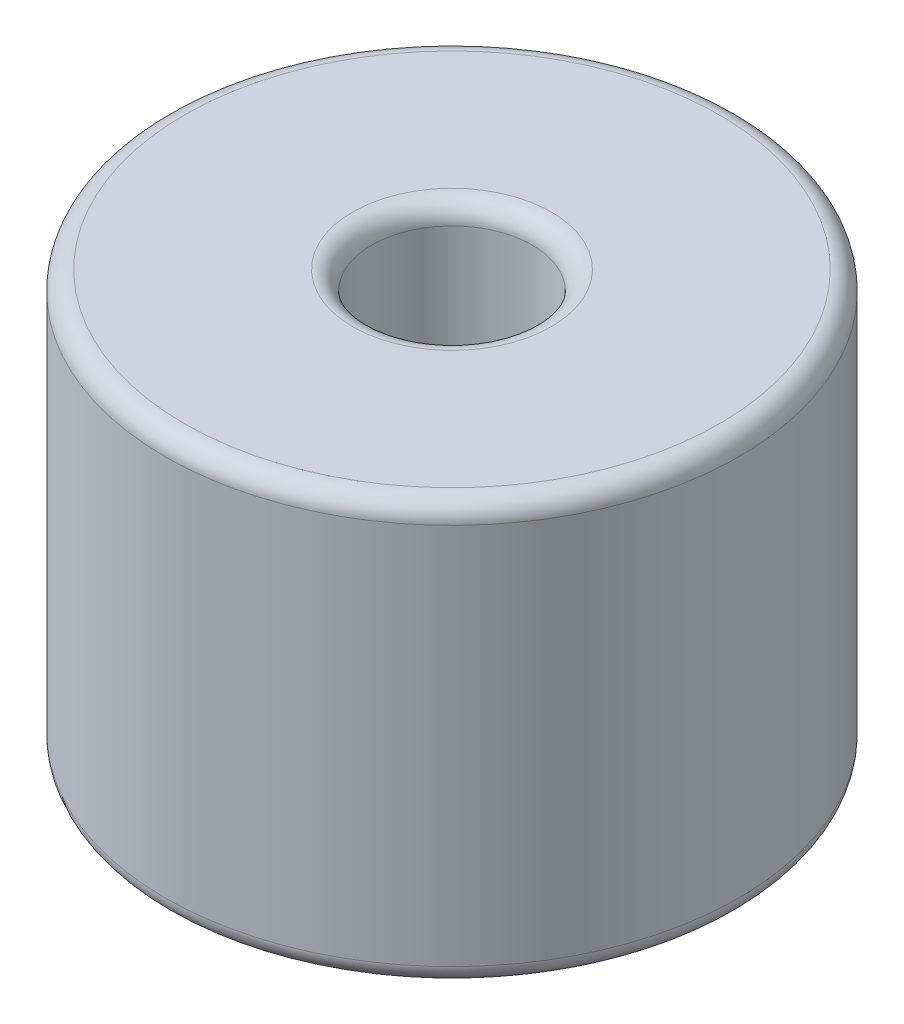
ISO-10303-21;
HEADER;
FILE_DESCRIPTION(('STEP AP214'),'2;1');
FILE_NAME('part.step','',(''),(''),'','','');
FILE_SCHEMA(('AUTOMOTIVE_DESIGN { 1 0 10303 214 1 1 1 1 }'));
ENDSEC;
DATA;
#1=APPLICATION_CONTEXT('core data for automotive mechanical design processes');
#2=APPLICATION_PROTOCOL_DEFINITION('international standard','automotive_design',2000,#1);
#3=PRODUCT_CONTEXT('',#1,'mechanical');
#4=PRODUCT('Part','Part','',(#3));
#5=PRODUCT_RELATED_PRODUCT_CATEGORY('part','',(#4));
#6=PRODUCT_DEFINITION_FORMATION('','',#4);
#7=PRODUCT_DEFINITION_CONTEXT('part definition',#1,'design');
#8=PRODUCT_DEFINITION('design','',#6,#7);
#9=PRODUCT_DEFINITION_SHAPE('','',#8);
#10=(LENGTH_UNIT() NAMED_UNIT(*) SI_UNIT(.MILLI.,.METRE.));
#11=(NAMED_UNIT(*) PLANE_ANGLE_UNIT() SI_UNIT($,.RADIAN.));
#12=(NAMED_UNIT(*) SI_UNIT($,.STERADIAN.) SOLID_ANGLE_UNIT());
#13=UNCERTAINTY_MEASURE_WITH_UNIT(LENGTH_MEASURE(1.E-05),#10,'distance_accuracy_value','');
#14=(GEOMETRIC_REPRESENTATION_CONTEXT(3) GLOBAL_UNCERTAINTY_ASSIGNED_CONTEXT((#13)) GLOBAL_UNIT_ASSIGNED_CONTEXT((#10,
#11,#12)) REPRESENTATION_CONTEXT('',''));
#15=CARTESIAN_POINT('',(0.,0.,0.));
#16=DIRECTION('',(0.,0.,1.));
#17=DIRECTION('',(1.,0.,0.));
#18=AXIS2_PLACEMENT_3D('',#15,#16,#17);
#19=CARTESIAN_POINT('',(0.,11.,0.));
#20=DIRECTION('',(0.,1.,0.));
#21=DIRECTION('',(0.,0.,1.));
#22=AXIS2_PLACEMENT_3D('',#19,#20,#21);
#23=PLANE('',#22);
#24=CARTESIAN_POINT('',(0.,11.,0.));
#25=DIRECTION('',(0.,1.,0.));
#26=DIRECTION('',(0.,0.,1.));
#27=AXIS2_PLACEMENT_3D('',#24,#25,#26);
#28=CIRCLE('',#27,2.6);
#29=CARTESIAN_POINT('',(0.,11.,2.6));
#30=VERTEX_POINT('',#29);
#31=EDGE_CURVE('E42',#30,#30,#28,.F.);
#32=ORIENTED_EDGE('',*,*,#31,.T.);
#33=EDGE_LOOP('',(#32));
#34=FACE_BOUND('',#33,.T.);
#35=CARTESIAN_POINT('',(0.,11.,0.));
#36=DIRECTION('',(0.,1.,0.));
#37=DIRECTION('',(0.,0.,1.));
#38=AXIS2_PLACEMENT_3D('',#35,#36,#37);
#39=CIRCLE('',#38,7.);
#40=CARTESIAN_POINT('',(0.,11.,7.));
#41=VERTEX_POINT('',#40);
#42=EDGE_CURVE('E46',#41,#41,#39,.T.);
#43=ORIENTED_EDGE('',*,*,#42,.T.);
#44=EDGE_LOOP('',(#43));
#45=FACE_BOUND('',#44,.T.);
#46=ADVANCED_FACE('F31',(#34,#45),#23,.T.);
#47=CARTESIAN_POINT('',(0.,0.,0.));
#48=DIRECTION('',(0.,1.,0.));
#49=DIRECTION('',(0.,0.,1.));
#50=AXIS2_PLACEMENT_3D('',#47,#48,#49);
#51=PLANE('',#50);
#52=CARTESIAN_POINT('',(0.,0.,0.));
#53=DIRECTION('',(0.,1.,0.));
#54=DIRECTION('',(0.,0.,1.));
#55=AXIS2_PLACEMENT_3D('',#52,#53,#54);
#56=CIRCLE('',#55,2.6);
#57=CARTESIAN_POINT('',(0.,0.,2.6));
#58=VERTEX_POINT('',#57);
#59=EDGE_CURVE('E57',#58,#58,#56,.T.);
#60=ORIENTED_EDGE('',*,*,#59,.T.);
#61=EDGE_LOOP('',(#60));
#62=FACE_BOUND('',#61,.T.);
#63=CARTESIAN_POINT('',(0.,0.,0.));
#64=DIRECTION('',(0.,1.,0.));
#65=DIRECTION('',(0.,0.,1.));
#66=AXIS2_PLACEMENT_3D('',#63,#64,#65);
#67=CIRCLE('',#66,7.);
#68=CARTESIAN_POINT('',(0.,0.,7.));
#69=VERTEX_POINT('',#68);
#70=EDGE_CURVE('E60',#69,#69,#67,.F.);
#71=ORIENTED_EDGE('',*,*,#70,.T.);
#72=EDGE_LOOP('',(#71));
#73=FACE_BOUND('',#72,.T.);
#74=ADVANCED_FACE('F64',(#62,#73),#51,.F.);
#75=CARTESIAN_POINT('',(0.,11.,0.));
#76=DIRECTION('',(0.,-1.,0.));
#77=DIRECTION('',(0.,0.,-1.));
#78=AXIS2_PLACEMENT_3D('',#75,#76,#77);
#79=CYLINDRICAL_SURFACE('',#78,7.5);
#80=CARTESIAN_POINT('',(0.,0.5,0.));
#81=DIRECTION('',(0.,1.,0.));
#82=DIRECTION('',(0.,0.,1.));
#83=AXIS2_PLACEMENT_3D('',#80,#81,#82);
#84=CIRCLE('',#83,7.5);
#85=CARTESIAN_POINT('',(0.,0.5,7.5));
#86=VERTEX_POINT('',#85);
#87=EDGE_CURVE('E10',#86,#86,#84,.T.);
#88=ORIENTED_EDGE('',*,*,#87,.T.);
#89=EDGE_LOOP('',(#88));
#90=FACE_BOUND('',#89,.T.);
#91=CARTESIAN_POINT('',(0.,10.5,0.));
#92=DIRECTION('',(0.,1.,0.));
#93=DIRECTION('',(0.,0.,1.));
#94=AXIS2_PLACEMENT_3D('',#91,#92,#93);
#95=CIRCLE('',#94,7.5);
#96=CARTESIAN_POINT('',(0.,10.5,7.5));
#97=VERTEX_POINT('',#96);
#98=EDGE_CURVE('E38',#97,#97,#95,.F.);
#99=ORIENTED_EDGE('',*,*,#98,.T.);
#100=EDGE_LOOP('',(#99));
#101=FACE_BOUND('',#100,.T.);
#102=ADVANCED_FACE('F84',(#90,#101),#79,.T.);
#103=CARTESIAN_POINT('',(0.,11.,0.));
#104=DIRECTION('',(0.,-1.,0.));
#105=DIRECTION('',(0.,0.,-1.));
#106=AXIS2_PLACEMENT_3D('',#103,#104,#105);
#107=CYLINDRICAL_SURFACE('',#106,2.1);
#108=CARTESIAN_POINT('',(0.,0.5,0.));
#109=DIRECTION('',(0.,1.,0.));
#110=DIRECTION('',(0.,0.,1.));
#111=AXIS2_PLACEMENT_3D('',#108,#109,#110);
#112=CIRCLE('',#111,2.1);
#113=CARTESIAN_POINT('',(0.,0.5,2.1));
#114=VERTEX_POINT('',#113);
#115=EDGE_CURVE('E51',#114,#114,#112,.F.);
#116=ORIENTED_EDGE('',*,*,#115,.T.);
#117=EDGE_LOOP('',(#116));
#118=FACE_BOUND('',#117,.T.);
#119=CARTESIAN_POINT('',(0.,10.5,0.));
#120=DIRECTION('',(0.,1.,0.));
#121=DIRECTION('',(0.,0.,1.));
#122=AXIS2_PLACEMENT_3D('',#119,#120,#121);
#123=CIRCLE('',#122,2.1);
#124=CARTESIAN_POINT('',(0.,10.5,2.1));
#125=VERTEX_POINT('',#124);
#126=EDGE_CURVE('E54',#125,#125,#123,.T.);
#127=ORIENTED_EDGE('',*,*,#126,.T.);
#128=EDGE_LOOP('',(#127));
#129=FACE_BOUND('',#128,.T.);
#130=ADVANCED_FACE('F89',(#118,#129),#107,.F.);
#131=CARTESIAN_POINT('',(0.,0.5,0.));
#132=DIRECTION('',(0.,1.,0.));
#133=DIRECTION('',(0.,0.,1.));
#134=AXIS2_PLACEMENT_3D('',#131,#132,#133);
#135=TOROIDAL_SURFACE('',#134,2.6,0.5);
#136=ORIENTED_EDGE('',*,*,#115,.F.);
#137=EDGE_LOOP('',(#136));
#138=FACE_BOUND('',#137,.T.);
#139=ORIENTED_EDGE('',*,*,#59,.F.);
#140=EDGE_LOOP('',(#139));
#141=FACE_BOUND('',#140,.T.);
#142=ADVANCED_FACE('F75',(#138,#141),#135,.T.);
#143=CARTESIAN_POINT('',(0.,10.5,0.));
#144=DIRECTION('',(0.,1.,0.));
#145=DIRECTION('',(0.,0.,1.));
#146=AXIS2_PLACEMENT_3D('',#143,#144,#145);
#147=TOROIDAL_SURFACE('',#146,2.6,0.5);
#148=ORIENTED_EDGE('',*,*,#31,.F.);
#149=EDGE_LOOP('',(#148));
#150=FACE_BOUND('',#149,.T.);
#151=ORIENTED_EDGE('',*,*,#126,.F.);
#152=EDGE_LOOP('',(#151));
#153=FACE_BOUND('',#152,.T.);
#154=ADVANCED_FACE('F69',(#150,#153),#147,.T.);
#155=CARTESIAN_POINT('',(0.,0.5,0.));
#156=DIRECTION('',(0.,1.,0.));
#157=DIRECTION('',(0.,0.,1.));
#158=AXIS2_PLACEMENT_3D('',#155,#156,#157);
#159=TOROIDAL_SURFACE('',#158,7.,0.5);
#160=ORIENTED_EDGE('',*,*,#70,.F.);
#161=EDGE_LOOP('',(#160));
#162=FACE_BOUND('',#161,.T.);
#163=ORIENTED_EDGE('',*,*,#87,.F.);
#164=EDGE_LOOP('',(#163));
#165=FACE_BOUND('',#164,.T.);
#166=ADVANCED_FACE('F66',(#162,#165),#159,.T.);
#167=CARTESIAN_POINT('',(0.,10.5,0.));
#168=DIRECTION('',(0.,1.,0.));
#169=DIRECTION('',(0.,0.,1.));
#170=AXIS2_PLACEMENT_3D('',#167,#168,#169);
#171=TOROIDAL_SURFACE('',#170,7.,0.5);
#172=ORIENTED_EDGE('',*,*,#98,.F.);
#173=EDGE_LOOP('',(#172));
#174=FACE_BOUND('',#173,.T.);
#175=ORIENTED_EDGE('',*,*,#42,.F.);
#176=EDGE_LOOP('',(#175));
#177=FACE_BOUND('',#176,.T.);
#178=ADVANCED_FACE('F33',(#174,#177),#171,.T.);
#179=CLOSED_SHELL('',(#46,#74,#102,#130,#142,#154,#166,#178));
#180=MANIFOLD_SOLID_BREP('B2',#179);
#181=ADVANCED_BREP_SHAPE_REPRESENTATION('',(#18,#180),#14);
#182=SHAPE_DEFINITION_REPRESENTATION(#9,#181);
ENDSEC;
END-ISO-10303-21;
